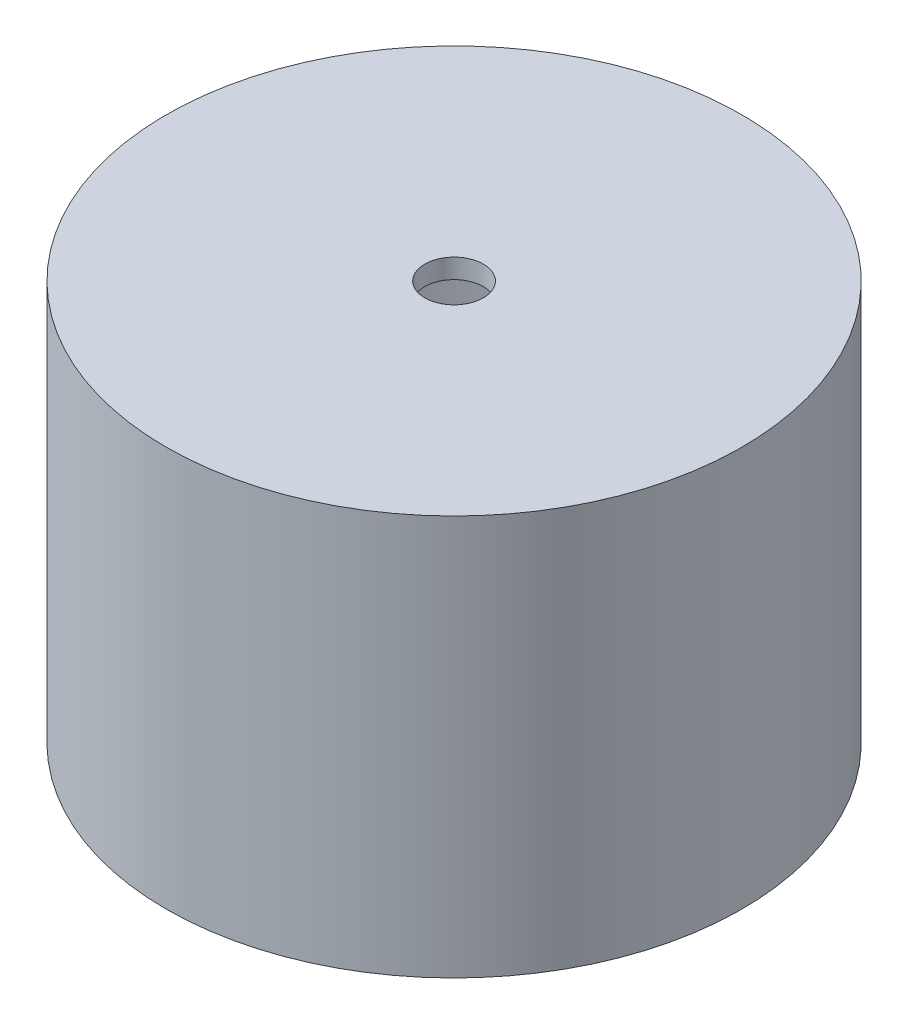
ISO-10303-21;
HEADER;
FILE_DESCRIPTION(('STEP AP214'),'2;1');
FILE_NAME('part.step','',(''),(''),'','','');
FILE_SCHEMA(('AUTOMOTIVE_DESIGN { 1 0 10303 214 1 1 1 1 }'));
ENDSEC;
DATA;
#1=APPLICATION_CONTEXT('core data for automotive mechanical design processes');
#2=APPLICATION_PROTOCOL_DEFINITION('international standard','automotive_design',2000,#1);
#3=PRODUCT_CONTEXT('',#1,'mechanical');
#4=PRODUCT('Part','Part','',(#3));
#5=PRODUCT_RELATED_PRODUCT_CATEGORY('part','',(#4));
#6=PRODUCT_DEFINITION_FORMATION('','',#4);
#7=PRODUCT_DEFINITION_CONTEXT('part definition',#1,'design');
#8=PRODUCT_DEFINITION('design','',#6,#7);
#9=PRODUCT_DEFINITION_SHAPE('','',#8);
#10=(LENGTH_UNIT() NAMED_UNIT(*) SI_UNIT(.MILLI.,.METRE.));
#11=(NAMED_UNIT(*) PLANE_ANGLE_UNIT() SI_UNIT($,.RADIAN.));
#12=(NAMED_UNIT(*) SI_UNIT($,.STERADIAN.) SOLID_ANGLE_UNIT());
#13=UNCERTAINTY_MEASURE_WITH_UNIT(LENGTH_MEASURE(1.E-05),#10,'distance_accuracy_value','');
#14=(GEOMETRIC_REPRESENTATION_CONTEXT(3) GLOBAL_UNCERTAINTY_ASSIGNED_CONTEXT((#13)) GLOBAL_UNIT_ASSIGNED_CONTEXT((#10,
#11,#12)) REPRESENTATION_CONTEXT('',''));
#15=CARTESIAN_POINT('',(0.,0.,0.));
#16=DIRECTION('',(0.,0.,1.));
#17=DIRECTION('',(1.,0.,0.));
#18=AXIS2_PLACEMENT_3D('',#15,#16,#17);
#19=CARTESIAN_POINT('',(0.,-2.54,0.));
#20=DIRECTION('',(0.,1.,0.));
#21=DIRECTION('',(0.,0.,1.));
#22=AXIS2_PLACEMENT_3D('',#19,#20,#21);
#23=PLANE('',#22);
#24=CARTESIAN_POINT('',(0.,-2.54,0.));
#25=DIRECTION('',(0.,1.,0.));
#26=DIRECTION('',(0.,0.,1.));
#27=AXIS2_PLACEMENT_3D('',#24,#25,#26);
#28=CIRCLE('',#27,3.81);
#29=CARTESIAN_POINT('',(0.,-2.54,3.81));
#30=VERTEX_POINT('',#29);
#31=EDGE_CURVE('E64',#30,#30,#28,.T.);
#32=ORIENTED_EDGE('',*,*,#31,.T.);
#33=EDGE_LOOP('',(#32));
#34=FACE_BOUND('',#33,.T.);
#35=CARTESIAN_POINT('',(0.,-2.54,-18.7325));
#36=DIRECTION('',(0.,1.,0.));
#37=DIRECTION('',(0.,0.,1.));
#38=AXIS2_PLACEMENT_3D('',#35,#36,#37);
#39=CIRCLE('',#38,9.39);
#40=CARTESIAN_POINT('',(0.,-2.54,-9.3425));
#41=VERTEX_POINT('',#40);
#42=EDGE_CURVE('E56',#41,#41,#39,.F.);
#43=ORIENTED_EDGE('',*,*,#42,.F.);
#44=EDGE_LOOP('',(#43));
#45=FACE_BOUND('',#44,.T.);
#46=CARTESIAN_POINT('',(0.,-2.54,18.7325));
#47=DIRECTION('',(0.,1.,0.));
#48=DIRECTION('',(0.,0.,1.));
#49=AXIS2_PLACEMENT_3D('',#46,#47,#48);
#50=CIRCLE('',#49,9.39);
#51=CARTESIAN_POINT('',(0.,-2.54,28.1225));
#52=VERTEX_POINT('',#51);
#53=EDGE_CURVE('E52',#52,#52,#50,.F.);
#54=ORIENTED_EDGE('',*,*,#53,.F.);
#55=EDGE_LOOP('',(#54));
#56=FACE_BOUND('',#55,.T.);
#57=CARTESIAN_POINT('',(0.,-2.54,0.));
#58=DIRECTION('',(0.,-1.,0.));
#59=DIRECTION('',(0.,0.,-1.));
#60=AXIS2_PLACEMENT_3D('',#57,#58,#59);
#61=CIRCLE('',#60,36.165);
#62=CARTESIAN_POINT('',(0.,-2.54,-36.165));
#63=VERTEX_POINT('',#62);
#64=EDGE_CURVE('E88',#63,#63,#61,.T.);
#65=ORIENTED_EDGE('',*,*,#64,.T.);
#66=EDGE_LOOP('',(#65));
#67=FACE_BOUND('',#66,.T.);
#68=ADVANCED_FACE('F41',(#34,#45,#56,#67),#23,.F.);
#69=CARTESIAN_POINT('',(0.,-2.54,0.));
#70=DIRECTION('',(0.,1.,0.));
#71=DIRECTION('',(0.,0.,1.));
#72=AXIS2_PLACEMENT_3D('',#69,#70,#71);
#73=CYLINDRICAL_SURFACE('',#72,37.465);
#74=CARTESIAN_POINT('',(0.,0.,0.));
#75=DIRECTION('',(0.,1.,0.));
#76=DIRECTION('',(0.,0.,1.));
#77=AXIS2_PLACEMENT_3D('',#74,#75,#76);
#78=CIRCLE('',#77,37.465);
#79=CARTESIAN_POINT('',(0.,0.,37.465));
#80=VERTEX_POINT('',#79);
#81=EDGE_CURVE('E61',#80,#80,#78,.T.);
#82=ORIENTED_EDGE('',*,*,#81,.F.);
#83=EDGE_LOOP('',(#82));
#84=FACE_BOUND('',#83,.T.);
#85=CARTESIAN_POINT('',(0.,-52.07,0.));
#86=DIRECTION('',(0.,1.,0.));
#87=DIRECTION('',(0.,0.,1.));
#88=AXIS2_PLACEMENT_3D('',#85,#86,#87);
#89=CIRCLE('',#88,37.465);
#90=CARTESIAN_POINT('',(0.,-52.07,37.465));
#91=VERTEX_POINT('',#90);
#92=EDGE_CURVE('E85',#91,#91,#89,.T.);
#93=ORIENTED_EDGE('',*,*,#92,.T.);
#94=EDGE_LOOP('',(#93));
#95=FACE_BOUND('',#94,.T.);
#96=ADVANCED_FACE('F43',(#84,#95),#73,.T.);
#97=CARTESIAN_POINT('',(0.,0.,0.));
#98=DIRECTION('',(0.,1.,0.));
#99=DIRECTION('',(0.,0.,1.));
#100=AXIS2_PLACEMENT_3D('',#97,#98,#99);
#101=PLANE('',#100);
#102=CARTESIAN_POINT('',(0.,0.,0.));
#103=DIRECTION('',(0.,1.,0.));
#104=DIRECTION('',(0.,0.,1.));
#105=AXIS2_PLACEMENT_3D('',#102,#103,#104);
#106=CIRCLE('',#105,3.81);
#107=CARTESIAN_POINT('',(0.,0.,3.81));
#108=VERTEX_POINT('',#107);
#109=EDGE_CURVE('E65',#108,#108,#106,.T.);
#110=ORIENTED_EDGE('',*,*,#109,.F.);
#111=EDGE_LOOP('',(#110));
#112=FACE_BOUND('',#111,.T.);
#113=ORIENTED_EDGE('',*,*,#81,.T.);
#114=EDGE_LOOP('',(#113));
#115=FACE_BOUND('',#114,.T.);
#116=ADVANCED_FACE('F117',(#112,#115),#101,.T.);
#117=CARTESIAN_POINT('',(0.,-2.54,0.));
#118=DIRECTION('',(0.,1.,0.));
#119=DIRECTION('',(0.,0.,1.));
#120=AXIS2_PLACEMENT_3D('',#117,#118,#119);
#121=CYLINDRICAL_SURFACE('',#120,3.81);
#122=ORIENTED_EDGE('',*,*,#31,.F.);
#123=EDGE_LOOP('',(#122));
#124=FACE_BOUND('',#123,.T.);
#125=ORIENTED_EDGE('',*,*,#109,.T.);
#126=EDGE_LOOP('',(#125));
#127=FACE_BOUND('',#126,.T.);
#128=ADVANCED_FACE('F121',(#124,#127),#121,.F.);
#129=CARTESIAN_POINT('',(0.,-53.34,-18.7325));
#130=DIRECTION('',(0.,-1.,0.));
#131=DIRECTION('',(0.,0.,-1.));
#132=AXIS2_PLACEMENT_3D('',#129,#130,#131);
#133=PLANE('',#132);
#134=CARTESIAN_POINT('',(0.,-53.34,-18.7325));
#135=DIRECTION('',(0.,-1.,0.));
#136=DIRECTION('',(0.,0.,-1.));
#137=AXIS2_PLACEMENT_3D('',#134,#135,#136);
#138=CIRCLE('',#137,9.39);
#139=CARTESIAN_POINT('',(0.,-53.34,-28.1225));
#140=VERTEX_POINT('',#139);
#141=EDGE_CURVE('E68',#140,#140,#138,.T.);
#142=ORIENTED_EDGE('',*,*,#141,.T.);
#143=EDGE_LOOP('',(#142));
#144=FACE_BOUND('',#143,.T.);
#145=CARTESIAN_POINT('',(0.,-53.34,-18.7325));
#146=DIRECTION('',(0.,-1.,0.));
#147=DIRECTION('',(0.,0.,1.));
#148=AXIS2_PLACEMENT_3D('',#145,#146,#147);
#149=CIRCLE('',#148,5.58);
#150=CARTESIAN_POINT('',(0.,-53.34,-13.1525));
#151=VERTEX_POINT('',#150);
#152=EDGE_CURVE('E73',#151,#151,#149,.T.);
#153=ORIENTED_EDGE('',*,*,#152,.F.);
#154=EDGE_LOOP('',(#153));
#155=FACE_BOUND('',#154,.T.);
#156=ADVANCED_FACE('F128',(#144,#155),#133,.T.);
#157=CARTESIAN_POINT('',(0.,-53.34,-18.7325));
#158=DIRECTION('',(0.,1.,0.));
#159=DIRECTION('',(0.,0.,1.));
#160=AXIS2_PLACEMENT_3D('',#157,#158,#159);
#161=CYLINDRICAL_SURFACE('',#160,9.39);
#162=ORIENTED_EDGE('',*,*,#141,.F.);
#163=EDGE_LOOP('',(#162));
#164=FACE_BOUND('',#163,.T.);
#165=ORIENTED_EDGE('',*,*,#42,.T.);
#166=EDGE_LOOP('',(#165));
#167=FACE_BOUND('',#166,.T.);
#168=ADVANCED_FACE('F140',(#164,#167),#161,.T.);
#169=CARTESIAN_POINT('',(0.,-53.34,-18.7325));
#170=DIRECTION('',(0.,1.,0.));
#171=DIRECTION('',(0.,0.,1.));
#172=AXIS2_PLACEMENT_3D('',#169,#170,#171);
#173=CYLINDRICAL_SURFACE('',#172,5.58);
#174=CARTESIAN_POINT('',(0.,-44.45,-18.7325));
#175=DIRECTION('',(0.,-1.,0.));
#176=DIRECTION('',(0.,0.,-1.));
#177=AXIS2_PLACEMENT_3D('',#174,#175,#176);
#178=CIRCLE('',#177,5.58);
#179=CARTESIAN_POINT('',(0.,-44.45,-24.3125));
#180=VERTEX_POINT('',#179);
#181=EDGE_CURVE('E10',#180,#180,#178,.T.);
#182=ORIENTED_EDGE('',*,*,#181,.F.);
#183=EDGE_LOOP('',(#182));
#184=FACE_BOUND('',#183,.T.);
#185=ORIENTED_EDGE('',*,*,#152,.T.);
#186=EDGE_LOOP('',(#185));
#187=FACE_BOUND('',#186,.T.);
#188=ADVANCED_FACE('F147',(#184,#187),#173,.F.);
#189=CARTESIAN_POINT('',(0.,-53.34,18.7325));
#190=DIRECTION('',(0.,-1.,0.));
#191=DIRECTION('',(0.,0.,-1.));
#192=AXIS2_PLACEMENT_3D('',#189,#190,#191);
#193=PLANE('',#192);
#194=CARTESIAN_POINT('',(0.,-53.34,18.7325));
#195=DIRECTION('',(0.,-1.,0.));
#196=DIRECTION('',(0.,0.,-1.));
#197=AXIS2_PLACEMENT_3D('',#194,#195,#196);
#198=CIRCLE('',#197,9.39);
#199=CARTESIAN_POINT('',(0.,-53.34,9.3425));
#200=VERTEX_POINT('',#199);
#201=EDGE_CURVE('E79',#200,#200,#198,.T.);
#202=ORIENTED_EDGE('',*,*,#201,.T.);
#203=EDGE_LOOP('',(#202));
#204=FACE_BOUND('',#203,.T.);
#205=CARTESIAN_POINT('',(0.,-53.34,18.7325));
#206=DIRECTION('',(0.,-1.,0.));
#207=DIRECTION('',(0.,0.,-1.));
#208=AXIS2_PLACEMENT_3D('',#205,#206,#207);
#209=CIRCLE('',#208,5.58);
#210=CARTESIAN_POINT('',(0.,-53.34,13.1525));
#211=VERTEX_POINT('',#210);
#212=EDGE_CURVE('E76',#211,#211,#209,.T.);
#213=ORIENTED_EDGE('',*,*,#212,.F.);
#214=EDGE_LOOP('',(#213));
#215=FACE_BOUND('',#214,.T.);
#216=ADVANCED_FACE('F152',(#204,#215),#193,.T.);
#217=CARTESIAN_POINT('',(0.,-53.34,18.7325));
#218=DIRECTION('',(0.,1.,0.));
#219=DIRECTION('',(0.,0.,1.));
#220=AXIS2_PLACEMENT_3D('',#217,#218,#219);
#221=CYLINDRICAL_SURFACE('',#220,9.39);
#222=ORIENTED_EDGE('',*,*,#201,.F.);
#223=EDGE_LOOP('',(#222));
#224=FACE_BOUND('',#223,.T.);
#225=ORIENTED_EDGE('',*,*,#53,.T.);
#226=EDGE_LOOP('',(#225));
#227=FACE_BOUND('',#226,.T.);
#228=ADVANCED_FACE('F106',(#224,#227),#221,.T.);
#229=CARTESIAN_POINT('',(0.,-53.34,18.7325));
#230=DIRECTION('',(0.,1.,0.));
#231=DIRECTION('',(0.,0.,1.));
#232=AXIS2_PLACEMENT_3D('',#229,#230,#231);
#233=CYLINDRICAL_SURFACE('',#232,5.58);
#234=CARTESIAN_POINT('',(0.,-44.45,18.7325));
#235=DIRECTION('',(0.,-1.,0.));
#236=DIRECTION('',(0.,0.,-1.));
#237=AXIS2_PLACEMENT_3D('',#234,#235,#236);
#238=CIRCLE('',#237,5.58);
#239=CARTESIAN_POINT('',(0.,-44.45,13.1525));
#240=VERTEX_POINT('',#239);
#241=EDGE_CURVE('E48',#240,#240,#238,.T.);
#242=ORIENTED_EDGE('',*,*,#241,.F.);
#243=EDGE_LOOP('',(#242));
#244=FACE_BOUND('',#243,.T.);
#245=ORIENTED_EDGE('',*,*,#212,.T.);
#246=EDGE_LOOP('',(#245));
#247=FACE_BOUND('',#246,.T.);
#248=ADVANCED_FACE('F96',(#244,#247),#233,.F.);
#249=CARTESIAN_POINT('',(0.,-158.037022228616,0.));
#250=DIRECTION('',(0.,1.,0.));
#251=DIRECTION('',(0.,0.,1.));
#252=AXIS2_PLACEMENT_3D('',#249,#250,#251);
#253=CYLINDRICAL_SURFACE('',#252,36.165);
#254=CARTESIAN_POINT('',(0.,-52.07,0.));
#255=DIRECTION('',(0.,1.,0.));
#256=DIRECTION('',(0.,0.,1.));
#257=AXIS2_PLACEMENT_3D('',#254,#255,#256);
#258=CIRCLE('',#257,36.165);
#259=CARTESIAN_POINT('',(0.,-52.07,36.165));
#260=VERTEX_POINT('',#259);
#261=EDGE_CURVE('E82',#260,#260,#258,.T.);
#262=ORIENTED_EDGE('',*,*,#261,.F.);
#263=EDGE_LOOP('',(#262));
#264=FACE_BOUND('',#263,.T.);
#265=ORIENTED_EDGE('',*,*,#64,.F.);
#266=EDGE_LOOP('',(#265));
#267=FACE_BOUND('',#266,.T.);
#268=ADVANCED_FACE('F93',(#264,#267),#253,.F.);
#269=CARTESIAN_POINT('',(0.,-52.07,0.));
#270=DIRECTION('',(0.,1.,0.));
#271=DIRECTION('',(0.,0.,1.));
#272=AXIS2_PLACEMENT_3D('',#269,#270,#271);
#273=PLANE('',#272);
#274=ORIENTED_EDGE('',*,*,#261,.T.);
#275=EDGE_LOOP('',(#274));
#276=FACE_BOUND('',#275,.T.);
#277=ORIENTED_EDGE('',*,*,#92,.F.);
#278=EDGE_LOOP('',(#277));
#279=FACE_BOUND('',#278,.T.);
#280=ADVANCED_FACE('F95',(#276,#279),#273,.F.);
#281=CARTESIAN_POINT('',(0.,-44.45,18.7325));
#282=DIRECTION('',(0.,-1.,0.));
#283=DIRECTION('',(0.,0.,-1.));
#284=AXIS2_PLACEMENT_3D('',#281,#282,#283);
#285=PLANE('',#284);
#286=ORIENTED_EDGE('',*,*,#241,.T.);
#287=EDGE_LOOP('',(#286));
#288=FACE_BOUND('',#287,.T.);
#289=ADVANCED_FACE('F103',(#288),#285,.T.);
#290=CARTESIAN_POINT('',(0.,-44.45,-18.7325));
#291=DIRECTION('',(0.,-1.,0.));
#292=DIRECTION('',(0.,0.,-1.));
#293=AXIS2_PLACEMENT_3D('',#290,#291,#292);
#294=PLANE('',#293);
#295=ORIENTED_EDGE('',*,*,#181,.T.);
#296=EDGE_LOOP('',(#295));
#297=FACE_BOUND('',#296,.T.);
#298=ADVANCED_FACE('F190',(#297),#294,.T.);
#299=CLOSED_SHELL('',(#68,#96,#116,#128,#156,#168,#188,#216,#228,#248,#268,#280,#289,#298));
#300=MANIFOLD_SOLID_BREP('B2',#299);
#301=ADVANCED_BREP_SHAPE_REPRESENTATION('',(#18,#300),#14);
#302=SHAPE_DEFINITION_REPRESENTATION(#9,#301);
ENDSEC;
END-ISO-10303-21;
